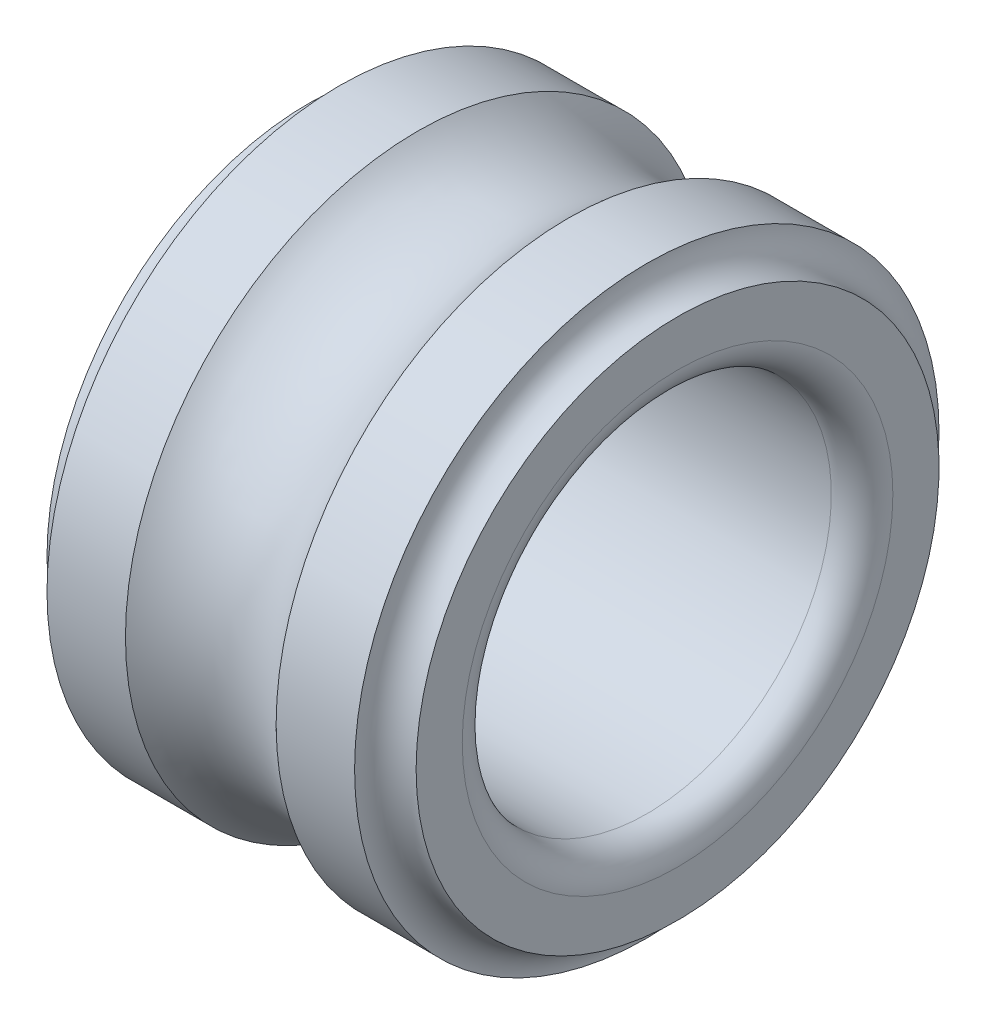
ISO-10303-21;
HEADER;
FILE_DESCRIPTION(('STEP AP214'),'2;1');
FILE_NAME('part.step','',(''),(''),'','','');
FILE_SCHEMA(('AUTOMOTIVE_DESIGN { 1 0 10303 214 1 1 1 1 }'));
ENDSEC;
DATA;
#1=APPLICATION_CONTEXT('core data for automotive mechanical design processes');
#2=APPLICATION_PROTOCOL_DEFINITION('international standard','automotive_design',2000,#1);
#3=PRODUCT_CONTEXT('',#1,'mechanical');
#4=PRODUCT('Part','Part','',(#3));
#5=PRODUCT_RELATED_PRODUCT_CATEGORY('part','',(#4));
#6=PRODUCT_DEFINITION_FORMATION('','',#4);
#7=PRODUCT_DEFINITION_CONTEXT('part definition',#1,'design');
#8=PRODUCT_DEFINITION('design','',#6,#7);
#9=PRODUCT_DEFINITION_SHAPE('','',#8);
#10=(LENGTH_UNIT() NAMED_UNIT(*) SI_UNIT(.MILLI.,.METRE.));
#11=(NAMED_UNIT(*) PLANE_ANGLE_UNIT() SI_UNIT($,.RADIAN.));
#12=(NAMED_UNIT(*) SI_UNIT($,.STERADIAN.) SOLID_ANGLE_UNIT());
#13=UNCERTAINTY_MEASURE_WITH_UNIT(LENGTH_MEASURE(1.E-05),#10,'distance_accuracy_value','');
#14=(GEOMETRIC_REPRESENTATION_CONTEXT(3) GLOBAL_UNCERTAINTY_ASSIGNED_CONTEXT((#13)) GLOBAL_UNIT_ASSIGNED_CONTEXT((#10,
#11,#12)) REPRESENTATION_CONTEXT('',''));
#15=CARTESIAN_POINT('',(0.,0.,0.));
#16=DIRECTION('',(0.,0.,1.));
#17=DIRECTION('',(1.,0.,0.));
#18=AXIS2_PLACEMENT_3D('',#15,#16,#17);
#19=CARTESIAN_POINT('',(-6.,0.,0.));
#20=DIRECTION('',(-1.,0.,0.));
#21=DIRECTION('',(0.,0.,1.));
#22=AXIS2_PLACEMENT_3D('',#19,#20,#21);
#23=CYLINDRICAL_SURFACE('',#22,9.49999999999999);
#24=CARTESIAN_POINT('',(2.44948974278318,0.,0.));
#25=DIRECTION('',(-1.,0.,0.));
#26=DIRECTION('',(0.,0.,1.));
#27=AXIS2_PLACEMENT_3D('',#24,#25,#26);
#28=CIRCLE('',#27,9.49999999999999);
#29=CARTESIAN_POINT('',(2.44948974278318,0.,9.49999999999999));
#30=VERTEX_POINT('',#29);
#31=EDGE_CURVE('E54',#30,#30,#28,.T.);
#32=ORIENTED_EDGE('',*,*,#31,.F.);
#33=EDGE_LOOP('',(#32));
#34=FACE_BOUND('',#33,.T.);
#35=CARTESIAN_POINT('',(5.,0.,0.));
#36=DIRECTION('',(-1.,0.,0.));
#37=DIRECTION('',(0.,0.,1.));
#38=AXIS2_PLACEMENT_3D('',#35,#36,#37);
#39=CIRCLE('',#38,9.49999999999999);
#40=CARTESIAN_POINT('',(5.,0.,9.49999999999999));
#41=VERTEX_POINT('',#40);
#42=EDGE_CURVE('E66',#41,#41,#39,.T.);
#43=ORIENTED_EDGE('',*,*,#42,.T.);
#44=EDGE_LOOP('',(#43));
#45=FACE_BOUND('',#44,.T.);
#46=ADVANCED_FACE('F34',(#34,#45),#23,.T.);
#47=CARTESIAN_POINT('',(-6.,7.,0.));
#48=DIRECTION('',(1.,0.,0.));
#49=DIRECTION('',(0.,0.,-1.));
#50=AXIS2_PLACEMENT_3D('',#47,#48,#49);
#51=PLANE('',#50);
#52=CARTESIAN_POINT('',(-6.,0.,0.));
#53=DIRECTION('',(-1.,0.,0.));
#54=DIRECTION('',(0.,0.,1.));
#55=AXIS2_PLACEMENT_3D('',#52,#53,#54);
#56=CIRCLE('',#55,7.);
#57=CARTESIAN_POINT('',(-6.,0.,7.));
#58=VERTEX_POINT('',#57);
#59=EDGE_CURVE('E10',#58,#58,#56,.T.);
#60=ORIENTED_EDGE('',*,*,#59,.F.);
#61=EDGE_LOOP('',(#60));
#62=FACE_BOUND('',#61,.T.);
#63=CARTESIAN_POINT('',(-6.,0.,0.));
#64=DIRECTION('',(-1.,0.,0.));
#65=DIRECTION('',(0.,0.,1.));
#66=AXIS2_PLACEMENT_3D('',#63,#64,#65);
#67=CIRCLE('',#66,8.49999999999999);
#68=CARTESIAN_POINT('',(-6.,0.,8.49999999999999));
#69=VERTEX_POINT('',#68);
#70=EDGE_CURVE('E63',#69,#69,#67,.T.);
#71=ORIENTED_EDGE('',*,*,#70,.T.);
#72=EDGE_LOOP('',(#71));
#73=FACE_BOUND('',#72,.T.);
#74=ADVANCED_FACE('F100',(#62,#73),#51,.F.);
#75=CARTESIAN_POINT('',(-6.,0.,0.));
#76=DIRECTION('',(-1.,0.,0.));
#77=DIRECTION('',(0.,0.,1.));
#78=AXIS2_PLACEMENT_3D('',#75,#76,#77);
#79=CYLINDRICAL_SURFACE('',#78,9.49999999999999);
#80=CARTESIAN_POINT('',(-2.44948974278318,0.,0.));
#81=DIRECTION('',(-1.,0.,0.));
#82=DIRECTION('',(0.,0.,1.));
#83=AXIS2_PLACEMENT_3D('',#80,#81,#82);
#84=CIRCLE('',#83,9.49999999999999);
#85=CARTESIAN_POINT('',(-2.44948974278318,0.,9.49999999999999));
#86=VERTEX_POINT('',#85);
#87=EDGE_CURVE('E57',#86,#86,#84,.T.);
#88=ORIENTED_EDGE('',*,*,#87,.T.);
#89=EDGE_LOOP('',(#88));
#90=FACE_BOUND('',#89,.T.);
#91=CARTESIAN_POINT('',(-5.,0.,0.));
#92=DIRECTION('',(-1.,0.,0.));
#93=DIRECTION('',(0.,0.,1.));
#94=AXIS2_PLACEMENT_3D('',#91,#92,#93);
#95=CIRCLE('',#94,9.49999999999999);
#96=CARTESIAN_POINT('',(-5.,0.,9.49999999999999));
#97=VERTEX_POINT('',#96);
#98=EDGE_CURVE('E60',#97,#97,#95,.T.);
#99=ORIENTED_EDGE('',*,*,#98,.F.);
#100=EDGE_LOOP('',(#99));
#101=FACE_BOUND('',#100,.T.);
#102=ADVANCED_FACE('F96',(#90,#101),#79,.T.);
#103=CARTESIAN_POINT('',(-5.,0.,0.));
#104=DIRECTION('',(-1.,0.,0.));
#105=DIRECTION('',(0.,0.,1.));
#106=AXIS2_PLACEMENT_3D('',#103,#104,#105);
#107=TOROIDAL_SURFACE('',#106,6.99999999999999,1.);
#108=CARTESIAN_POINT('',(-4.99999999999999,0.,0.));
#109=DIRECTION('',(-1.,0.,0.));
#110=DIRECTION('',(0.,0.,1.));
#111=AXIS2_PLACEMENT_3D('',#108,#109,#110);
#112=CIRCLE('',#111,5.99999999999999);
#113=CARTESIAN_POINT('',(-4.99999999999999,0.,5.99999999999999));
#114=VERTEX_POINT('',#113);
#115=EDGE_CURVE('E41',#114,#114,#112,.T.);
#116=ORIENTED_EDGE('',*,*,#115,.F.);
#117=EDGE_LOOP('',(#116));
#118=FACE_BOUND('',#117,.T.);
#119=ORIENTED_EDGE('',*,*,#59,.T.);
#120=EDGE_LOOP('',(#119));
#121=FACE_BOUND('',#120,.T.);
#122=ADVANCED_FACE('F91',(#118,#121),#107,.T.);
#123=CARTESIAN_POINT('',(-6.,0.,0.));
#124=DIRECTION('',(-1.,0.,0.));
#125=DIRECTION('',(0.,0.,1.));
#126=AXIS2_PLACEMENT_3D('',#123,#124,#125);
#127=CYLINDRICAL_SURFACE('',#126,5.99999999999999);
#128=CARTESIAN_POINT('',(4.99999999999999,0.,0.));
#129=DIRECTION('',(-1.,0.,0.));
#130=DIRECTION('',(0.,0.,1.));
#131=AXIS2_PLACEMENT_3D('',#128,#129,#130);
#132=CIRCLE('',#131,5.99999999999999);
#133=CARTESIAN_POINT('',(4.99999999999999,0.,5.99999999999999));
#134=VERTEX_POINT('',#133);
#135=EDGE_CURVE('E45',#134,#134,#132,.T.);
#136=ORIENTED_EDGE('',*,*,#135,.F.);
#137=EDGE_LOOP('',(#136));
#138=FACE_BOUND('',#137,.T.);
#139=ORIENTED_EDGE('',*,*,#115,.T.);
#140=EDGE_LOOP('',(#139));
#141=FACE_BOUND('',#140,.T.);
#142=ADVANCED_FACE('F86',(#138,#141),#127,.F.);
#143=CARTESIAN_POINT('',(5.,0.,0.));
#144=DIRECTION('',(-1.,0.,0.));
#145=DIRECTION('',(0.,0.,1.));
#146=AXIS2_PLACEMENT_3D('',#143,#144,#145);
#147=TOROIDAL_SURFACE('',#146,6.99999999999999,1.);
#148=CARTESIAN_POINT('',(6.,0.,0.));
#149=DIRECTION('',(-1.,0.,0.));
#150=DIRECTION('',(0.,0.,1.));
#151=AXIS2_PLACEMENT_3D('',#148,#149,#150);
#152=CIRCLE('',#151,7.);
#153=CARTESIAN_POINT('',(6.,0.,7.));
#154=VERTEX_POINT('',#153);
#155=EDGE_CURVE('E49',#154,#154,#152,.T.);
#156=ORIENTED_EDGE('',*,*,#155,.F.);
#157=EDGE_LOOP('',(#156));
#158=FACE_BOUND('',#157,.T.);
#159=ORIENTED_EDGE('',*,*,#135,.T.);
#160=EDGE_LOOP('',(#159));
#161=FACE_BOUND('',#160,.T.);
#162=ADVANCED_FACE('F80',(#158,#161),#147,.T.);
#163=CARTESIAN_POINT('',(6.,7.,0.));
#164=DIRECTION('',(-1.,0.,0.));
#165=DIRECTION('',(0.,0.,1.));
#166=AXIS2_PLACEMENT_3D('',#163,#164,#165);
#167=PLANE('',#166);
#168=CARTESIAN_POINT('',(6.,0.,0.));
#169=DIRECTION('',(-1.,0.,0.));
#170=DIRECTION('',(0.,0.,1.));
#171=AXIS2_PLACEMENT_3D('',#168,#169,#170);
#172=CIRCLE('',#171,8.49999999999999);
#173=CARTESIAN_POINT('',(6.,0.,8.49999999999999));
#174=VERTEX_POINT('',#173);
#175=EDGE_CURVE('E69',#174,#174,#172,.T.);
#176=ORIENTED_EDGE('',*,*,#175,.F.);
#177=EDGE_LOOP('',(#176));
#178=FACE_BOUND('',#177,.T.);
#179=ORIENTED_EDGE('',*,*,#155,.T.);
#180=EDGE_LOOP('',(#179));
#181=FACE_BOUND('',#180,.T.);
#182=ADVANCED_FACE('F76',(#178,#181),#167,.F.);
#183=CARTESIAN_POINT('',(0.,0.,0.));
#184=DIRECTION('',(-1.,0.,0.));
#185=DIRECTION('',(0.,0.,1.));
#186=AXIS2_PLACEMENT_3D('',#183,#184,#185);
#187=TOROIDAL_SURFACE('',#186,12.,3.5);
#188=ORIENTED_EDGE('',*,*,#87,.F.);
#189=EDGE_LOOP('',(#188));
#190=FACE_BOUND('',#189,.T.);
#191=ORIENTED_EDGE('',*,*,#31,.T.);
#192=EDGE_LOOP('',(#191));
#193=FACE_BOUND('',#192,.T.);
#194=ADVANCED_FACE('F79',(#190,#193),#187,.F.);
#195=CARTESIAN_POINT('',(6.,0.,0.));
#196=DIRECTION('',(1.,0.,0.));
#197=DIRECTION('',(0.,0.,-1.));
#198=AXIS2_PLACEMENT_3D('',#195,#196,#197);
#199=TOROIDAL_SURFACE('',#198,9.49999999999999,1.);
#200=ORIENTED_EDGE('',*,*,#175,.T.);
#201=EDGE_LOOP('',(#200));
#202=FACE_BOUND('',#201,.T.);
#203=ORIENTED_EDGE('',*,*,#42,.F.);
#204=EDGE_LOOP('',(#203));
#205=FACE_BOUND('',#204,.T.);
#206=ADVANCED_FACE('F73',(#202,#205),#199,.F.);
#207=CARTESIAN_POINT('',(-6.,0.,0.));
#208=DIRECTION('',(-1.,0.,0.));
#209=DIRECTION('',(0.,0.,1.));
#210=AXIS2_PLACEMENT_3D('',#207,#208,#209);
#211=TOROIDAL_SURFACE('',#210,9.49999999999999,1.);
#212=ORIENTED_EDGE('',*,*,#98,.T.);
#213=EDGE_LOOP('',(#212));
#214=FACE_BOUND('',#213,.T.);
#215=ORIENTED_EDGE('',*,*,#70,.F.);
#216=EDGE_LOOP('',(#215));
#217=FACE_BOUND('',#216,.T.);
#218=ADVANCED_FACE('F36',(#214,#217),#211,.F.);
#219=CLOSED_SHELL('',(#46,#74,#102,#122,#142,#162,#182,#194,#206,#218));
#220=MANIFOLD_SOLID_BREP('B2',#219);
#221=ADVANCED_BREP_SHAPE_REPRESENTATION('',(#18,#220),#14);
#222=SHAPE_DEFINITION_REPRESENTATION(#9,#221);
ENDSEC;
END-ISO-10303-21;
